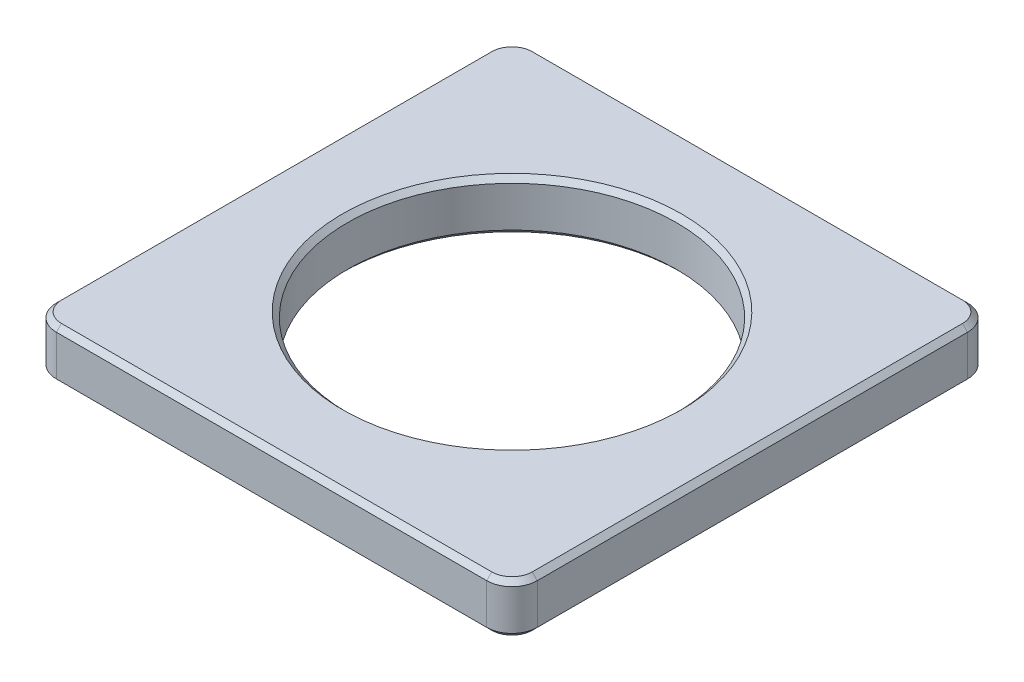
ISO-10303-21;
HEADER;
FILE_DESCRIPTION(('STEP AP214'),'2;1');
FILE_NAME('part.step','',(''),(''),'','','');
FILE_SCHEMA(('AUTOMOTIVE_DESIGN { 1 0 10303 214 1 1 1 1 }'));
ENDSEC;
DATA;
#1=APPLICATION_CONTEXT('core data for automotive mechanical design processes');
#2=APPLICATION_PROTOCOL_DEFINITION('international standard','automotive_design',2000,#1);
#3=PRODUCT_CONTEXT('',#1,'mechanical');
#4=PRODUCT('Part','Part','',(#3));
#5=PRODUCT_RELATED_PRODUCT_CATEGORY('part','',(#4));
#6=PRODUCT_DEFINITION_FORMATION('','',#4);
#7=PRODUCT_DEFINITION_CONTEXT('part definition',#1,'design');
#8=PRODUCT_DEFINITION('design','',#6,#7);
#9=PRODUCT_DEFINITION_SHAPE('','',#8);
#10=(LENGTH_UNIT() NAMED_UNIT(*) SI_UNIT(.MILLI.,.METRE.));
#11=(NAMED_UNIT(*) PLANE_ANGLE_UNIT() SI_UNIT($,.RADIAN.));
#12=(NAMED_UNIT(*) SI_UNIT($,.STERADIAN.) SOLID_ANGLE_UNIT());
#13=UNCERTAINTY_MEASURE_WITH_UNIT(LENGTH_MEASURE(1.E-05),#10,'distance_accuracy_value','');
#14=(GEOMETRIC_REPRESENTATION_CONTEXT(3) GLOBAL_UNCERTAINTY_ASSIGNED_CONTEXT((#13)) GLOBAL_UNIT_ASSIGNED_CONTEXT((#10,
#11,#12)) REPRESENTATION_CONTEXT('',''));
#15=CARTESIAN_POINT('',(0.,0.,0.));
#16=DIRECTION('',(0.,0.,1.));
#17=DIRECTION('',(1.,0.,0.));
#18=AXIS2_PLACEMENT_3D('',#15,#16,#17);
#19=CARTESIAN_POINT('',(0.,10.,0.));
#20=DIRECTION('',(0.,-1.,0.));
#21=DIRECTION('',(0.,0.,-1.));
#22=AXIS2_PLACEMENT_3D('',#19,#20,#21);
#23=PLANE('',#22);
#24=CARTESIAN_POINT('',(0.,10.,0.));
#25=DIRECTION('',(0.,-1.,0.));
#26=DIRECTION('',(0.,0.,-1.));
#27=AXIS2_PLACEMENT_3D('',#24,#25,#26);
#28=CIRCLE('',#27,33.5);
#29=CARTESIAN_POINT('',(0.,10.,-33.5));
#30=VERTEX_POINT('',#29);
#31=EDGE_CURVE('E11',#30,#30,#28,.T.);
#32=ORIENTED_EDGE('',*,*,#31,.T.);
#33=EDGE_LOOP('',(#32));
#34=FACE_BOUND('',#33,.T.);
#35=DIRECTION('',(0.,0.,-1.));
#36=VECTOR('',#35,1.);
#37=CARTESIAN_POINT('',(46.5,10.,0.));
#38=LINE('',#37,#36);
#39=CARTESIAN_POINT('',(46.5,10.,42.5));
#40=VERTEX_POINT('',#39);
#41=CARTESIAN_POINT('',(46.5,10.,-42.5));
#42=VERTEX_POINT('',#41);
#43=EDGE_CURVE('E66',#40,#42,#38,.T.);
#44=ORIENTED_EDGE('',*,*,#43,.T.);
#45=CARTESIAN_POINT('',(42.5,10.,-42.5));
#46=DIRECTION('',(0.,-1.,0.));
#47=DIRECTION('',(0.,0.,-1.));
#48=AXIS2_PLACEMENT_3D('',#45,#46,#47);
#49=CIRCLE('',#48,4.00000000000001);
#50=CARTESIAN_POINT('',(42.5,10.,-46.5));
#51=VERTEX_POINT('',#50);
#52=EDGE_CURVE('E58',#42,#51,#49,.F.);
#53=ORIENTED_EDGE('',*,*,#52,.T.);
#54=DIRECTION('',(-1.,0.,0.));
#55=VECTOR('',#54,1.);
#56=CARTESIAN_POINT('',(0.,10.,-46.5));
#57=LINE('',#56,#55);
#58=CARTESIAN_POINT('',(-42.5,10.,-46.5));
#59=VERTEX_POINT('',#58);
#60=EDGE_CURVE('E259',#51,#59,#57,.T.);
#61=ORIENTED_EDGE('',*,*,#60,.T.);
#62=CARTESIAN_POINT('',(-42.5,10.,-42.5));
#63=DIRECTION('',(0.,-1.,0.));
#64=DIRECTION('',(0.,0.,-1.));
#65=AXIS2_PLACEMENT_3D('',#62,#63,#64);
#66=CIRCLE('',#65,4.00000000000001);
#67=CARTESIAN_POINT('',(-46.5,10.,-42.5));
#68=VERTEX_POINT('',#67);
#69=EDGE_CURVE('E262',#59,#68,#66,.F.);
#70=ORIENTED_EDGE('',*,*,#69,.T.);
#71=DIRECTION('',(0.,0.,1.));
#72=VECTOR('',#71,1.);
#73=CARTESIAN_POINT('',(-46.5,10.,0.));
#74=LINE('',#73,#72);
#75=CARTESIAN_POINT('',(-46.5,10.,42.5));
#76=VERTEX_POINT('',#75);
#77=EDGE_CURVE('E265',#68,#76,#74,.T.);
#78=ORIENTED_EDGE('',*,*,#77,.T.);
#79=CARTESIAN_POINT('',(-42.5,10.,42.5));
#80=DIRECTION('',(0.,-1.,0.));
#81=DIRECTION('',(0.,0.,-1.));
#82=AXIS2_PLACEMENT_3D('',#79,#80,#81);
#83=CIRCLE('',#82,4.00000000000001);
#84=CARTESIAN_POINT('',(-42.5,10.,46.5));
#85=VERTEX_POINT('',#84);
#86=EDGE_CURVE('E268',#76,#85,#83,.F.);
#87=ORIENTED_EDGE('',*,*,#86,.T.);
#88=DIRECTION('',(1.,0.,0.));
#89=VECTOR('',#88,1.);
#90=CARTESIAN_POINT('',(0.,10.,46.5));
#91=LINE('',#90,#89);
#92=CARTESIAN_POINT('',(42.5,10.,46.5));
#93=VERTEX_POINT('',#92);
#94=EDGE_CURVE('E271',#85,#93,#91,.T.);
#95=ORIENTED_EDGE('',*,*,#94,.T.);
#96=CARTESIAN_POINT('',(42.5,10.,42.5));
#97=DIRECTION('',(0.,-1.,0.));
#98=DIRECTION('',(0.,0.,-1.));
#99=AXIS2_PLACEMENT_3D('',#96,#97,#98);
#100=CIRCLE('',#99,4.00000000000001);
#101=EDGE_CURVE('E71',#93,#40,#100,.F.);
#102=ORIENTED_EDGE('',*,*,#101,.T.);
#103=EDGE_LOOP('',(#44,#53,#61,#70,#78,#87,#95,#102));
#104=FACE_BOUND('',#103,.T.);
#105=ADVANCED_FACE('F47',(#34,#104),#23,.F.);
#106=CARTESIAN_POINT('',(0.,0.,0.));
#107=DIRECTION('',(0.,-1.,0.));
#108=DIRECTION('',(0.,0.,-1.));
#109=AXIS2_PLACEMENT_3D('',#106,#107,#108);
#110=PLANE('',#109);
#111=CARTESIAN_POINT('',(0.,0.,0.));
#112=DIRECTION('',(0.,-1.,0.));
#113=DIRECTION('',(0.,0.,-1.));
#114=AXIS2_PLACEMENT_3D('',#111,#112,#113);
#115=CIRCLE('',#114,33.5);
#116=CARTESIAN_POINT('',(0.,0.,-33.5));
#117=VERTEX_POINT('',#116);
#118=EDGE_CURVE('E193',#117,#117,#115,.F.);
#119=ORIENTED_EDGE('',*,*,#118,.T.);
#120=EDGE_LOOP('',(#119));
#121=FACE_BOUND('',#120,.T.);
#122=DIRECTION('',(-1.,0.,0.));
#123=VECTOR('',#122,1.);
#124=CARTESIAN_POINT('',(-42.5,0.,46.5));
#125=LINE('',#124,#123);
#126=CARTESIAN_POINT('',(42.5,0.,46.5));
#127=VERTEX_POINT('',#126);
#128=CARTESIAN_POINT('',(-42.5,0.,46.5));
#129=VERTEX_POINT('',#128);
#130=EDGE_CURVE('E190',#127,#129,#125,.T.);
#131=ORIENTED_EDGE('',*,*,#130,.T.);
#132=CARTESIAN_POINT('',(-42.5,0.,42.5));
#133=DIRECTION('',(0.,-1.,0.));
#134=DIRECTION('',(0.,0.,-1.));
#135=AXIS2_PLACEMENT_3D('',#132,#133,#134);
#136=CIRCLE('',#135,4.);
#137=CARTESIAN_POINT('',(-46.5,0.,42.5));
#138=VERTEX_POINT('',#137);
#139=EDGE_CURVE('E169',#129,#138,#136,.T.);
#140=ORIENTED_EDGE('',*,*,#139,.T.);
#141=DIRECTION('',(0.,0.,-1.));
#142=VECTOR('',#141,1.);
#143=CARTESIAN_POINT('',(-46.5,0.,-42.5));
#144=LINE('',#143,#142);
#145=CARTESIAN_POINT('',(-46.5,0.,-42.5));
#146=VERTEX_POINT('',#145);
#147=EDGE_CURVE('E178',#138,#146,#144,.T.);
#148=ORIENTED_EDGE('',*,*,#147,.T.);
#149=CARTESIAN_POINT('',(-42.5,0.,-42.5));
#150=DIRECTION('',(0.,-1.,0.));
#151=DIRECTION('',(0.,0.,-1.));
#152=AXIS2_PLACEMENT_3D('',#149,#150,#151);
#153=CIRCLE('',#152,4.);
#154=CARTESIAN_POINT('',(-42.5,0.,-46.5));
#155=VERTEX_POINT('',#154);
#156=EDGE_CURVE('E185',#146,#155,#153,.T.);
#157=ORIENTED_EDGE('',*,*,#156,.T.);
#158=DIRECTION('',(1.,0.,0.));
#159=VECTOR('',#158,1.);
#160=CARTESIAN_POINT('',(42.5,0.,-46.5));
#161=LINE('',#160,#159);
#162=CARTESIAN_POINT('',(42.5,0.,-46.5));
#163=VERTEX_POINT('',#162);
#164=EDGE_CURVE('E384',#155,#163,#161,.T.);
#165=ORIENTED_EDGE('',*,*,#164,.T.);
#166=CARTESIAN_POINT('',(42.5,0.,-42.5));
#167=DIRECTION('',(0.,-1.,0.));
#168=DIRECTION('',(0.,0.,-1.));
#169=AXIS2_PLACEMENT_3D('',#166,#167,#168);
#170=CIRCLE('',#169,4.);
#171=CARTESIAN_POINT('',(46.5,0.,-42.5));
#172=VERTEX_POINT('',#171);
#173=EDGE_CURVE('E387',#163,#172,#170,.T.);
#174=ORIENTED_EDGE('',*,*,#173,.T.);
#175=DIRECTION('',(0.,0.,1.));
#176=VECTOR('',#175,1.);
#177=CARTESIAN_POINT('',(46.5,0.,42.5));
#178=LINE('',#177,#176);
#179=CARTESIAN_POINT('',(46.5,0.,42.5));
#180=VERTEX_POINT('',#179);
#181=EDGE_CURVE('E390',#172,#180,#178,.T.);
#182=ORIENTED_EDGE('',*,*,#181,.T.);
#183=CARTESIAN_POINT('',(42.5,0.,42.5));
#184=DIRECTION('',(0.,-1.,0.));
#185=DIRECTION('',(0.,0.,-1.));
#186=AXIS2_PLACEMENT_3D('',#183,#184,#185);
#187=CIRCLE('',#186,4.);
#188=EDGE_CURVE('E200',#180,#127,#187,.T.);
#189=ORIENTED_EDGE('',*,*,#188,.T.);
#190=EDGE_LOOP('',(#131,#140,#148,#157,#165,#174,#182,#189));
#191=FACE_BOUND('',#190,.T.);
#192=ADVANCED_FACE('F188',(#121,#191),#110,.T.);
#193=CARTESIAN_POINT('',(47.5,10.,47.5));
#194=DIRECTION('',(-1.,0.,0.));
#195=DIRECTION('',(0.,0.,1.));
#196=AXIS2_PLACEMENT_3D('',#193,#194,#195);
#197=PLANE('',#196);
#198=DIRECTION('',(0.,-1.,0.));
#199=VECTOR('',#198,1.);
#200=CARTESIAN_POINT('',(47.5,10.,42.5));
#201=LINE('',#200,#199);
#202=CARTESIAN_POINT('',(47.5,9.,42.5));
#203=VERTEX_POINT('',#202);
#204=CARTESIAN_POINT('',(47.5,1.,42.5));
#205=VERTEX_POINT('',#204);
#206=EDGE_CURVE('E369',#203,#205,#201,.T.);
#207=ORIENTED_EDGE('',*,*,#206,.T.);
#208=DIRECTION('',(0.,0.,-1.));
#209=VECTOR('',#208,1.);
#210=CARTESIAN_POINT('',(47.5,1.,-42.5));
#211=LINE('',#210,#209);
#212=CARTESIAN_POINT('',(47.5,1.,-42.5));
#213=VERTEX_POINT('',#212);
#214=EDGE_CURVE('E231',#205,#213,#211,.T.);
#215=ORIENTED_EDGE('',*,*,#214,.T.);
#216=DIRECTION('',(0.,-1.,0.));
#217=VECTOR('',#216,1.);
#218=CARTESIAN_POINT('',(47.5,10.,-42.5));
#219=LINE('',#218,#217);
#220=CARTESIAN_POINT('',(47.5,9.,-42.5));
#221=VERTEX_POINT('',#220);
#222=EDGE_CURVE('E373',#213,#221,#219,.F.);
#223=ORIENTED_EDGE('',*,*,#222,.T.);
#224=DIRECTION('',(0.,0.,1.));
#225=VECTOR('',#224,1.);
#226=CARTESIAN_POINT('',(47.5,9.,47.5));
#227=LINE('',#226,#225);
#228=EDGE_CURVE('E228',#221,#203,#227,.T.);
#229=ORIENTED_EDGE('',*,*,#228,.T.);
#230=EDGE_LOOP('',(#207,#215,#223,#229));
#231=FACE_BOUND('',#230,.T.);
#232=ADVANCED_FACE('F448',(#231),#197,.F.);
#233=CARTESIAN_POINT('',(-47.5,10.,-47.5));
#234=DIRECTION('',(0.,0.,1.));
#235=DIRECTION('',(1.,0.,0.));
#236=AXIS2_PLACEMENT_3D('',#233,#234,#235);
#237=PLANE('',#236);
#238=DIRECTION('',(0.,-1.,0.));
#239=VECTOR('',#238,1.);
#240=CARTESIAN_POINT('',(42.5,10.,-47.5));
#241=LINE('',#240,#239);
#242=CARTESIAN_POINT('',(42.5,9.,-47.5));
#243=VERTEX_POINT('',#242);
#244=CARTESIAN_POINT('',(42.5,1.,-47.5));
#245=VERTEX_POINT('',#244);
#246=EDGE_CURVE('E359',#243,#245,#241,.T.);
#247=ORIENTED_EDGE('',*,*,#246,.T.);
#248=DIRECTION('',(-1.,0.,0.));
#249=VECTOR('',#248,1.);
#250=CARTESIAN_POINT('',(-42.5,1.,-47.5));
#251=LINE('',#250,#249);
#252=CARTESIAN_POINT('',(-42.5,1.,-47.5));
#253=VERTEX_POINT('',#252);
#254=EDGE_CURVE('E244',#245,#253,#251,.T.);
#255=ORIENTED_EDGE('',*,*,#254,.T.);
#256=DIRECTION('',(0.,-1.,0.));
#257=VECTOR('',#256,1.);
#258=CARTESIAN_POINT('',(-42.5,10.,-47.5));
#259=LINE('',#258,#257);
#260=CARTESIAN_POINT('',(-42.5,9.,-47.5));
#261=VERTEX_POINT('',#260);
#262=EDGE_CURVE('E365',#253,#261,#259,.F.);
#263=ORIENTED_EDGE('',*,*,#262,.T.);
#264=DIRECTION('',(1.,0.,0.));
#265=VECTOR('',#264,1.);
#266=CARTESIAN_POINT('',(-47.5,9.,-47.5));
#267=LINE('',#266,#265);
#268=EDGE_CURVE('E241',#261,#243,#267,.T.);
#269=ORIENTED_EDGE('',*,*,#268,.T.);
#270=EDGE_LOOP('',(#247,#255,#263,#269));
#271=FACE_BOUND('',#270,.T.);
#272=ADVANCED_FACE('F432',(#271),#237,.F.);
#273=CARTESIAN_POINT('',(-47.5,10.,47.5));
#274=DIRECTION('',(1.,0.,0.));
#275=DIRECTION('',(0.,0.,-1.));
#276=AXIS2_PLACEMENT_3D('',#273,#274,#275);
#277=PLANE('',#276);
#278=DIRECTION('',(0.,-1.,0.));
#279=VECTOR('',#278,1.);
#280=CARTESIAN_POINT('',(-47.5,10.,-42.5));
#281=LINE('',#280,#279);
#282=CARTESIAN_POINT('',(-47.5,9.,-42.5));
#283=VERTEX_POINT('',#282);
#284=CARTESIAN_POINT('',(-47.5,1.,-42.5));
#285=VERTEX_POINT('',#284);
#286=EDGE_CURVE('E356',#283,#285,#281,.T.);
#287=ORIENTED_EDGE('',*,*,#286,.T.);
#288=DIRECTION('',(0.,0.,1.));
#289=VECTOR('',#288,1.);
#290=CARTESIAN_POINT('',(-47.5,1.,42.5));
#291=LINE('',#290,#289);
#292=CARTESIAN_POINT('',(-47.5,1.,42.5));
#293=VERTEX_POINT('',#292);
#294=EDGE_CURVE('E256',#285,#293,#291,.T.);
#295=ORIENTED_EDGE('',*,*,#294,.T.);
#296=DIRECTION('',(0.,-1.,0.));
#297=VECTOR('',#296,1.);
#298=CARTESIAN_POINT('',(-47.5,10.,42.5));
#299=LINE('',#298,#297);
#300=CARTESIAN_POINT('',(-47.5,9.,42.5));
#301=VERTEX_POINT('',#300);
#302=EDGE_CURVE('E304',#293,#301,#299,.F.);
#303=ORIENTED_EDGE('',*,*,#302,.T.);
#304=DIRECTION('',(0.,0.,-1.));
#305=VECTOR('',#304,1.);
#306=CARTESIAN_POINT('',(-47.5,9.,47.5));
#307=LINE('',#306,#305);
#308=EDGE_CURVE('E253',#301,#283,#307,.T.);
#309=ORIENTED_EDGE('',*,*,#308,.T.);
#310=EDGE_LOOP('',(#287,#295,#303,#309));
#311=FACE_BOUND('',#310,.T.);
#312=ADVANCED_FACE('F353',(#311),#277,.F.);
#313=CARTESIAN_POINT('',(-47.5,10.,47.5));
#314=DIRECTION('',(0.,0.,-1.));
#315=DIRECTION('',(-1.,0.,0.));
#316=AXIS2_PLACEMENT_3D('',#313,#314,#315);
#317=PLANE('',#316);
#318=DIRECTION('',(0.,-1.,0.));
#319=VECTOR('',#318,1.);
#320=CARTESIAN_POINT('',(-42.5,10.,47.5));
#321=LINE('',#320,#319);
#322=CARTESIAN_POINT('',(-42.5,9.,47.5));
#323=VERTEX_POINT('',#322);
#324=CARTESIAN_POINT('',(-42.5,1.,47.5));
#325=VERTEX_POINT('',#324);
#326=EDGE_CURVE('E350',#323,#325,#321,.T.);
#327=ORIENTED_EDGE('',*,*,#326,.T.);
#328=DIRECTION('',(1.,0.,0.));
#329=VECTOR('',#328,1.);
#330=CARTESIAN_POINT('',(42.5,1.,47.5));
#331=LINE('',#330,#329);
#332=CARTESIAN_POINT('',(42.5,1.,47.5));
#333=VERTEX_POINT('',#332);
#334=EDGE_CURVE('E219',#325,#333,#331,.T.);
#335=ORIENTED_EDGE('',*,*,#334,.T.);
#336=DIRECTION('',(0.,-1.,0.));
#337=VECTOR('',#336,1.);
#338=CARTESIAN_POINT('',(42.5,10.,47.5));
#339=LINE('',#338,#337);
#340=CARTESIAN_POINT('',(42.5,9.,47.5));
#341=VERTEX_POINT('',#340);
#342=EDGE_CURVE('E186',#333,#341,#339,.F.);
#343=ORIENTED_EDGE('',*,*,#342,.T.);
#344=DIRECTION('',(-1.,0.,0.));
#345=VECTOR('',#344,1.);
#346=CARTESIAN_POINT('',(-47.5,9.,47.5));
#347=LINE('',#346,#345);
#348=EDGE_CURVE('E216',#341,#323,#347,.T.);
#349=ORIENTED_EDGE('',*,*,#348,.T.);
#350=EDGE_LOOP('',(#327,#335,#343,#349));
#351=FACE_BOUND('',#350,.T.);
#352=ADVANCED_FACE('F405',(#351),#317,.F.);
#353=CARTESIAN_POINT('',(0.,10.,0.));
#354=DIRECTION('',(0.,-1.,0.));
#355=DIRECTION('',(0.,0.,-1.));
#356=AXIS2_PLACEMENT_3D('',#353,#354,#355);
#357=CYLINDRICAL_SURFACE('',#356,32.5);
#358=CARTESIAN_POINT('',(0.,0.999999999999994,0.));
#359=DIRECTION('',(0.,-1.,0.));
#360=DIRECTION('',(0.,0.,-1.));
#361=AXIS2_PLACEMENT_3D('',#358,#359,#360);
#362=CIRCLE('',#361,32.5);
#363=CARTESIAN_POINT('',(0.,0.999999999999994,-32.5));
#364=VERTEX_POINT('',#363);
#365=EDGE_CURVE('E207',#364,#364,#362,.T.);
#366=ORIENTED_EDGE('',*,*,#365,.T.);
#367=EDGE_LOOP('',(#366));
#368=FACE_BOUND('',#367,.T.);
#369=CARTESIAN_POINT('',(0.,8.99999999999999,0.));
#370=DIRECTION('',(0.,-1.,0.));
#371=DIRECTION('',(0.,0.,-1.));
#372=AXIS2_PLACEMENT_3D('',#369,#370,#371);
#373=CIRCLE('',#372,32.5);
#374=CARTESIAN_POINT('',(0.,8.99999999999999,-32.5));
#375=VERTEX_POINT('',#374);
#376=EDGE_CURVE('E198',#375,#375,#373,.F.);
#377=ORIENTED_EDGE('',*,*,#376,.T.);
#378=EDGE_LOOP('',(#377));
#379=FACE_BOUND('',#378,.T.);
#380=ADVANCED_FACE('F465',(#368,#379),#357,.F.);
#381=CARTESIAN_POINT('',(-42.5,10.,-42.5));
#382=DIRECTION('',(0.,-1.,0.));
#383=DIRECTION('',(0.,0.,-1.));
#384=AXIS2_PLACEMENT_3D('',#381,#382,#383);
#385=CYLINDRICAL_SURFACE('',#384,5.);
#386=ORIENTED_EDGE('',*,*,#262,.F.);
#387=CARTESIAN_POINT('',(-42.5,1.,-42.5));
#388=DIRECTION('',(0.,-1.,0.));
#389=DIRECTION('',(0.,0.,-1.));
#390=AXIS2_PLACEMENT_3D('',#387,#388,#389);
#391=CIRCLE('',#390,5.);
#392=EDGE_CURVE('E250',#253,#285,#391,.F.);
#393=ORIENTED_EDGE('',*,*,#392,.T.);
#394=ORIENTED_EDGE('',*,*,#286,.F.);
#395=CARTESIAN_POINT('',(-42.5,9.,-42.5));
#396=DIRECTION('',(0.,-1.,0.));
#397=DIRECTION('',(0.,0.,-1.));
#398=AXIS2_PLACEMENT_3D('',#395,#396,#397);
#399=CIRCLE('',#398,5.);
#400=EDGE_CURVE('E247',#283,#261,#399,.T.);
#401=ORIENTED_EDGE('',*,*,#400,.T.);
#402=EDGE_LOOP('',(#386,#393,#394,#401));
#403=FACE_BOUND('',#402,.T.);
#404=ADVANCED_FACE('F486',(#403),#385,.T.);
#405=CARTESIAN_POINT('',(42.5,10.,-42.5));
#406=DIRECTION('',(0.,-1.,0.));
#407=DIRECTION('',(0.,0.,-1.));
#408=AXIS2_PLACEMENT_3D('',#405,#406,#407);
#409=CYLINDRICAL_SURFACE('',#408,5.);
#410=ORIENTED_EDGE('',*,*,#222,.F.);
#411=CARTESIAN_POINT('',(42.5,1.,-42.5));
#412=DIRECTION('',(0.,-1.,0.));
#413=DIRECTION('',(0.,0.,-1.));
#414=AXIS2_PLACEMENT_3D('',#411,#412,#413);
#415=CIRCLE('',#414,5.);
#416=EDGE_CURVE('E238',#213,#245,#415,.F.);
#417=ORIENTED_EDGE('',*,*,#416,.T.);
#418=ORIENTED_EDGE('',*,*,#246,.F.);
#419=CARTESIAN_POINT('',(42.5,9.,-42.5));
#420=DIRECTION('',(0.,-1.,0.));
#421=DIRECTION('',(0.,0.,-1.));
#422=AXIS2_PLACEMENT_3D('',#419,#420,#421);
#423=CIRCLE('',#422,5.);
#424=EDGE_CURVE('E234',#243,#221,#423,.T.);
#425=ORIENTED_EDGE('',*,*,#424,.T.);
#426=EDGE_LOOP('',(#410,#417,#418,#425));
#427=FACE_BOUND('',#426,.T.);
#428=ADVANCED_FACE('F437',(#427),#409,.T.);
#429=CARTESIAN_POINT('',(42.5,10.,42.5));
#430=DIRECTION('',(0.,-1.,0.));
#431=DIRECTION('',(0.,0.,-1.));
#432=AXIS2_PLACEMENT_3D('',#429,#430,#431);
#433=CYLINDRICAL_SURFACE('',#432,5.);
#434=ORIENTED_EDGE('',*,*,#342,.F.);
#435=CARTESIAN_POINT('',(42.5,1.,42.5));
#436=DIRECTION('',(0.,-1.,0.));
#437=DIRECTION('',(0.,0.,-1.));
#438=AXIS2_PLACEMENT_3D('',#435,#436,#437);
#439=CIRCLE('',#438,5.);
#440=EDGE_CURVE('E225',#333,#205,#439,.F.);
#441=ORIENTED_EDGE('',*,*,#440,.T.);
#442=ORIENTED_EDGE('',*,*,#206,.F.);
#443=CARTESIAN_POINT('',(42.5,9.,42.5));
#444=DIRECTION('',(0.,-1.,0.));
#445=DIRECTION('',(0.,0.,-1.));
#446=AXIS2_PLACEMENT_3D('',#443,#444,#445);
#447=CIRCLE('',#446,5.);
#448=EDGE_CURVE('E222',#203,#341,#447,.T.);
#449=ORIENTED_EDGE('',*,*,#448,.T.);
#450=EDGE_LOOP('',(#434,#441,#442,#449));
#451=FACE_BOUND('',#450,.T.);
#452=ADVANCED_FACE('F407',(#451),#433,.T.);
#453=CARTESIAN_POINT('',(-42.5,10.,42.5));
#454=DIRECTION('',(0.,-1.,0.));
#455=DIRECTION('',(0.,0.,-1.));
#456=AXIS2_PLACEMENT_3D('',#453,#454,#455);
#457=CYLINDRICAL_SURFACE('',#456,5.);
#458=ORIENTED_EDGE('',*,*,#302,.F.);
#459=CARTESIAN_POINT('',(-42.5,1.,42.5));
#460=DIRECTION('',(0.,-1.,0.));
#461=DIRECTION('',(0.,0.,-1.));
#462=AXIS2_PLACEMENT_3D('',#459,#460,#461);
#463=CIRCLE('',#462,5.);
#464=EDGE_CURVE('E171',#293,#325,#463,.F.);
#465=ORIENTED_EDGE('',*,*,#464,.T.);
#466=ORIENTED_EDGE('',*,*,#326,.F.);
#467=CARTESIAN_POINT('',(-42.5,9.,42.5));
#468=DIRECTION('',(0.,-1.,0.));
#469=DIRECTION('',(0.,0.,-1.));
#470=AXIS2_PLACEMENT_3D('',#467,#468,#469);
#471=CIRCLE('',#470,5.);
#472=EDGE_CURVE('E211',#323,#301,#471,.T.);
#473=ORIENTED_EDGE('',*,*,#472,.T.);
#474=EDGE_LOOP('',(#458,#465,#466,#473));
#475=FACE_BOUND('',#474,.T.);
#476=ADVANCED_FACE('F348',(#475),#457,.T.);
#477=CARTESIAN_POINT('',(0.,0.,0.));
#478=DIRECTION('',(0.,-1.,0.));
#479=DIRECTION('',(0.,0.,-1.));
#480=AXIS2_PLACEMENT_3D('',#477,#478,#479);
#481=CONICAL_SURFACE('',#480,33.5,0.785398163397445);
#482=ORIENTED_EDGE('',*,*,#365,.F.);
#483=EDGE_LOOP('',(#482));
#484=FACE_BOUND('',#483,.T.);
#485=ORIENTED_EDGE('',*,*,#118,.F.);
#486=EDGE_LOOP('',(#485));
#487=FACE_BOUND('',#486,.T.);
#488=ADVANCED_FACE('F515',(#484,#487),#481,.F.);
#489=CARTESIAN_POINT('',(42.5,0.,-42.5));
#490=DIRECTION('',(0.,1.,0.));
#491=DIRECTION('',(0.,0.,1.));
#492=AXIS2_PLACEMENT_3D('',#489,#490,#491);
#493=CONICAL_SURFACE('',#492,4.,0.78539816339745);
#494=DIRECTION('',(0.,-0.707106781186547,0.707106781186547));
#495=VECTOR('',#494,1.);
#496=CARTESIAN_POINT('',(42.5,1.,-47.5));
#497=LINE('',#496,#495);
#498=EDGE_CURVE('E296',#245,#163,#497,.T.);
#499=ORIENTED_EDGE('',*,*,#498,.F.);
#500=ORIENTED_EDGE('',*,*,#416,.F.);
#501=DIRECTION('',(0.707106781186547,0.707106781186547,0.));
#502=VECTOR('',#501,1.);
#503=CARTESIAN_POINT('',(46.5,0.,-42.5));
#504=LINE('',#503,#502);
#505=EDGE_CURVE('E300',#172,#213,#504,.T.);
#506=ORIENTED_EDGE('',*,*,#505,.F.);
#507=ORIENTED_EDGE('',*,*,#173,.F.);
#508=EDGE_LOOP('',(#499,#500,#506,#507));
#509=FACE_BOUND('',#508,.T.);
#510=ADVANCED_FACE('F441',(#509),#493,.T.);
#511=CARTESIAN_POINT('',(47.5,1.,47.5));
#512=DIRECTION('',(0.707106781186547,-0.707106781186547,0.));
#513=DIRECTION('',(0.,0.,1.));
#514=AXIS2_PLACEMENT_3D('',#511,#512,#513);
#515=PLANE('',#514);
#516=ORIENTED_EDGE('',*,*,#505,.T.);
#517=ORIENTED_EDGE('',*,*,#214,.F.);
#518=DIRECTION('',(0.707106781186547,0.707106781186547,0.));
#519=VECTOR('',#518,1.);
#520=CARTESIAN_POINT('',(46.5,0.,42.5));
#521=LINE('',#520,#519);
#522=EDGE_CURVE('E292',#180,#205,#521,.T.);
#523=ORIENTED_EDGE('',*,*,#522,.F.);
#524=ORIENTED_EDGE('',*,*,#181,.F.);
#525=EDGE_LOOP('',(#516,#517,#523,#524));
#526=FACE_BOUND('',#525,.T.);
#527=ADVANCED_FACE('F446',(#526),#515,.T.);
#528=CARTESIAN_POINT('',(-47.5,1.,-47.5));
#529=DIRECTION('',(0.,-0.707106781186547,-0.707106781186547));
#530=DIRECTION('',(1.,0.,0.));
#531=AXIS2_PLACEMENT_3D('',#528,#529,#530);
#532=PLANE('',#531);
#533=ORIENTED_EDGE('',*,*,#498,.T.);
#534=ORIENTED_EDGE('',*,*,#164,.F.);
#535=DIRECTION('',(0.,-0.707106781186547,0.707106781186547));
#536=VECTOR('',#535,1.);
#537=CARTESIAN_POINT('',(-42.5,1.,-47.5));
#538=LINE('',#537,#536);
#539=EDGE_CURVE('E288',#253,#155,#538,.T.);
#540=ORIENTED_EDGE('',*,*,#539,.F.);
#541=ORIENTED_EDGE('',*,*,#254,.F.);
#542=EDGE_LOOP('',(#533,#534,#540,#541));
#543=FACE_BOUND('',#542,.T.);
#544=ADVANCED_FACE('F538',(#543),#532,.T.);
#545=CARTESIAN_POINT('',(42.5,0.,42.5));
#546=DIRECTION('',(0.,1.,0.));
#547=DIRECTION('',(0.,0.,1.));
#548=AXIS2_PLACEMENT_3D('',#545,#546,#547);
#549=CONICAL_SURFACE('',#548,4.,0.78539816339745);
#550=ORIENTED_EDGE('',*,*,#522,.T.);
#551=ORIENTED_EDGE('',*,*,#440,.F.);
#552=DIRECTION('',(0.,0.707106781186547,0.707106781186547));
#553=VECTOR('',#552,1.);
#554=CARTESIAN_POINT('',(42.5,0.,46.5));
#555=LINE('',#554,#553);
#556=EDGE_CURVE('E284',#127,#333,#555,.T.);
#557=ORIENTED_EDGE('',*,*,#556,.F.);
#558=ORIENTED_EDGE('',*,*,#188,.F.);
#559=EDGE_LOOP('',(#550,#551,#557,#558));
#560=FACE_BOUND('',#559,.T.);
#561=ADVANCED_FACE('F399',(#560),#549,.T.);
#562=CARTESIAN_POINT('',(-42.5,0.,-42.5));
#563=DIRECTION('',(0.,1.,0.));
#564=DIRECTION('',(0.,0.,1.));
#565=AXIS2_PLACEMENT_3D('',#562,#563,#564);
#566=CONICAL_SURFACE('',#565,4.,0.78539816339745);
#567=ORIENTED_EDGE('',*,*,#539,.T.);
#568=ORIENTED_EDGE('',*,*,#156,.F.);
#569=DIRECTION('',(0.707106781186547,-0.707106781186547,0.));
#570=VECTOR('',#569,1.);
#571=CARTESIAN_POINT('',(-47.5,1.,-42.5));
#572=LINE('',#571,#570);
#573=EDGE_CURVE('E181',#285,#146,#572,.T.);
#574=ORIENTED_EDGE('',*,*,#573,.F.);
#575=ORIENTED_EDGE('',*,*,#392,.F.);
#576=EDGE_LOOP('',(#567,#568,#574,#575));
#577=FACE_BOUND('',#576,.T.);
#578=ADVANCED_FACE('F554',(#577),#566,.T.);
#579=CARTESIAN_POINT('',(-47.5,1.,47.5));
#580=DIRECTION('',(0.,-0.707106781186547,0.707106781186547));
#581=DIRECTION('',(-1.,0.,0.));
#582=AXIS2_PLACEMENT_3D('',#579,#580,#581);
#583=PLANE('',#582);
#584=ORIENTED_EDGE('',*,*,#556,.T.);
#585=ORIENTED_EDGE('',*,*,#334,.F.);
#586=DIRECTION('',(0.,0.707106781186547,0.707106781186547));
#587=VECTOR('',#586,1.);
#588=CARTESIAN_POINT('',(-42.5,0.,46.5));
#589=LINE('',#588,#587);
#590=EDGE_CURVE('E175',#129,#325,#589,.T.);
#591=ORIENTED_EDGE('',*,*,#590,.F.);
#592=ORIENTED_EDGE('',*,*,#130,.F.);
#593=EDGE_LOOP('',(#584,#585,#591,#592));
#594=FACE_BOUND('',#593,.T.);
#595=ADVANCED_FACE('F402',(#594),#583,.T.);
#596=CARTESIAN_POINT('',(-47.5,1.,47.5));
#597=DIRECTION('',(-0.707106781186547,-0.707106781186547,0.));
#598=DIRECTION('',(0.,0.,-1.));
#599=AXIS2_PLACEMENT_3D('',#596,#597,#598);
#600=PLANE('',#599);
#601=ORIENTED_EDGE('',*,*,#573,.T.);
#602=ORIENTED_EDGE('',*,*,#147,.F.);
#603=DIRECTION('',(0.707106781186547,-0.707106781186547,0.));
#604=VECTOR('',#603,1.);
#605=CARTESIAN_POINT('',(-47.5,1.,42.5));
#606=LINE('',#605,#604);
#607=EDGE_CURVE('E165',#293,#138,#606,.T.);
#608=ORIENTED_EDGE('',*,*,#607,.F.);
#609=ORIENTED_EDGE('',*,*,#294,.F.);
#610=EDGE_LOOP('',(#601,#602,#608,#609));
#611=FACE_BOUND('',#610,.T.);
#612=ADVANCED_FACE('F179',(#611),#600,.T.);
#613=CARTESIAN_POINT('',(-42.5,0.,42.5));
#614=DIRECTION('',(0.,1.,0.));
#615=DIRECTION('',(0.,0.,1.));
#616=AXIS2_PLACEMENT_3D('',#613,#614,#615);
#617=CONICAL_SURFACE('',#616,4.,0.78539816339745);
#618=ORIENTED_EDGE('',*,*,#590,.T.);
#619=ORIENTED_EDGE('',*,*,#464,.F.);
#620=ORIENTED_EDGE('',*,*,#607,.T.);
#621=ORIENTED_EDGE('',*,*,#139,.F.);
#622=EDGE_LOOP('',(#618,#619,#620,#621));
#623=FACE_BOUND('',#622,.T.);
#624=ADVANCED_FACE('F167',(#623),#617,.T.);
#625=CARTESIAN_POINT('',(0.,8.99999999999999,0.));
#626=DIRECTION('',(0.,1.,0.));
#627=DIRECTION('',(0.,0.,1.));
#628=AXIS2_PLACEMENT_3D('',#625,#626,#627);
#629=CONICAL_SURFACE('',#628,32.5,0.785398163397448);
#630=ORIENTED_EDGE('',*,*,#31,.F.);
#631=EDGE_LOOP('',(#630));
#632=FACE_BOUND('',#631,.T.);
#633=ORIENTED_EDGE('',*,*,#376,.F.);
#634=EDGE_LOOP('',(#633));
#635=FACE_BOUND('',#634,.T.);
#636=ADVANCED_FACE('F584',(#632,#635),#629,.F.);
#637=CARTESIAN_POINT('',(-42.5,10.,42.5));
#638=DIRECTION('',(0.,-1.,0.));
#639=DIRECTION('',(0.,0.,-1.));
#640=AXIS2_PLACEMENT_3D('',#637,#638,#639);
#641=CONICAL_SURFACE('',#640,4.00000000000001,0.785398163397443);
#642=DIRECTION('',(0.707106781186543,0.707106781186552,0.));
#643=VECTOR('',#642,1.);
#644=CARTESIAN_POINT('',(-47.5,9.,42.5));
#645=LINE('',#644,#643);
#646=EDGE_CURVE('E326',#301,#76,#645,.T.);
#647=ORIENTED_EDGE('',*,*,#646,.F.);
#648=ORIENTED_EDGE('',*,*,#472,.F.);
#649=DIRECTION('',(0.,-0.707106781186552,0.707106781186543));
#650=VECTOR('',#649,1.);
#651=CARTESIAN_POINT('',(-42.5,10.,46.5));
#652=LINE('',#651,#650);
#653=EDGE_CURVE('E52',#85,#323,#652,.T.);
#654=ORIENTED_EDGE('',*,*,#653,.F.);
#655=ORIENTED_EDGE('',*,*,#86,.F.);
#656=EDGE_LOOP('',(#647,#648,#654,#655));
#657=FACE_BOUND('',#656,.T.);
#658=ADVANCED_FACE('F50',(#657),#641,.T.);
#659=CARTESIAN_POINT('',(0.,10.,46.5));
#660=DIRECTION('',(0.,-0.707106781186543,-0.707106781186552));
#661=DIRECTION('',(1.,0.,0.));
#662=AXIS2_PLACEMENT_3D('',#659,#660,#661);
#663=PLANE('',#662);
#664=ORIENTED_EDGE('',*,*,#653,.T.);
#665=ORIENTED_EDGE('',*,*,#348,.F.);
#666=DIRECTION('',(0.,-0.707106781186552,0.707106781186543));
#667=VECTOR('',#666,1.);
#668=CARTESIAN_POINT('',(42.5,10.,46.5));
#669=LINE('',#668,#667);
#670=EDGE_CURVE('E323',#93,#341,#669,.T.);
#671=ORIENTED_EDGE('',*,*,#670,.F.);
#672=ORIENTED_EDGE('',*,*,#94,.F.);
#673=EDGE_LOOP('',(#664,#665,#671,#672));
#674=FACE_BOUND('',#673,.T.);
#675=ADVANCED_FACE('F339',(#674),#663,.F.);
#676=CARTESIAN_POINT('',(-46.5,10.,0.));
#677=DIRECTION('',(0.707106781186552,-0.707106781186543,0.));
#678=DIRECTION('',(0.,0.,1.));
#679=AXIS2_PLACEMENT_3D('',#676,#677,#678);
#680=PLANE('',#679);
#681=ORIENTED_EDGE('',*,*,#646,.T.);
#682=ORIENTED_EDGE('',*,*,#77,.F.);
#683=DIRECTION('',(0.707106781186543,0.707106781186552,0.));
#684=VECTOR('',#683,1.);
#685=CARTESIAN_POINT('',(-47.5,9.,-42.5));
#686=LINE('',#685,#684);
#687=EDGE_CURVE('E319',#283,#68,#686,.T.);
#688=ORIENTED_EDGE('',*,*,#687,.F.);
#689=ORIENTED_EDGE('',*,*,#308,.F.);
#690=EDGE_LOOP('',(#681,#682,#688,#689));
#691=FACE_BOUND('',#690,.T.);
#692=ADVANCED_FACE('F606',(#691),#680,.F.);
#693=CARTESIAN_POINT('',(42.5,10.,42.5));
#694=DIRECTION('',(0.,-1.,0.));
#695=DIRECTION('',(0.,0.,-1.));
#696=AXIS2_PLACEMENT_3D('',#693,#694,#695);
#697=CONICAL_SURFACE('',#696,4.00000000000001,0.785398163397443);
#698=ORIENTED_EDGE('',*,*,#670,.T.);
#699=ORIENTED_EDGE('',*,*,#448,.F.);
#700=DIRECTION('',(0.707106781186543,-0.707106781186552,0.));
#701=VECTOR('',#700,1.);
#702=CARTESIAN_POINT('',(46.5,10.,42.5));
#703=LINE('',#702,#701);
#704=EDGE_CURVE('E315',#40,#203,#703,.T.);
#705=ORIENTED_EDGE('',*,*,#704,.F.);
#706=ORIENTED_EDGE('',*,*,#101,.F.);
#707=EDGE_LOOP('',(#698,#699,#705,#706));
#708=FACE_BOUND('',#707,.T.);
#709=ADVANCED_FACE('F411',(#708),#697,.T.);
#710=CARTESIAN_POINT('',(-42.5,10.,-42.5));
#711=DIRECTION('',(0.,-1.,0.));
#712=DIRECTION('',(0.,0.,-1.));
#713=AXIS2_PLACEMENT_3D('',#710,#711,#712);
#714=CONICAL_SURFACE('',#713,4.00000000000001,0.785398163397443);
#715=ORIENTED_EDGE('',*,*,#687,.T.);
#716=ORIENTED_EDGE('',*,*,#69,.F.);
#717=DIRECTION('',(0.,0.707106781186552,0.707106781186543));
#718=VECTOR('',#717,1.);
#719=CARTESIAN_POINT('',(-42.5,9.,-47.5));
#720=LINE('',#719,#718);
#721=EDGE_CURVE('E311',#261,#59,#720,.T.);
#722=ORIENTED_EDGE('',*,*,#721,.F.);
#723=ORIENTED_EDGE('',*,*,#400,.F.);
#724=EDGE_LOOP('',(#715,#716,#722,#723));
#725=FACE_BOUND('',#724,.T.);
#726=ADVANCED_FACE('F425',(#725),#714,.T.);
#727=CARTESIAN_POINT('',(46.5,10.,0.));
#728=DIRECTION('',(-0.707106781186552,-0.707106781186543,0.));
#729=DIRECTION('',(0.,0.,-1.));
#730=AXIS2_PLACEMENT_3D('',#727,#728,#729);
#731=PLANE('',#730);
#732=ORIENTED_EDGE('',*,*,#704,.T.);
#733=ORIENTED_EDGE('',*,*,#228,.F.);
#734=DIRECTION('',(0.707106781186543,-0.707106781186552,0.));
#735=VECTOR('',#734,1.);
#736=CARTESIAN_POINT('',(46.5,10.,-42.5));
#737=LINE('',#736,#735);
#738=EDGE_CURVE('E308',#42,#221,#737,.T.);
#739=ORIENTED_EDGE('',*,*,#738,.F.);
#740=ORIENTED_EDGE('',*,*,#43,.F.);
#741=EDGE_LOOP('',(#732,#733,#739,#740));
#742=FACE_BOUND('',#741,.T.);
#743=ADVANCED_FACE('F414',(#742),#731,.F.);
#744=CARTESIAN_POINT('',(0.,10.,-46.5));
#745=DIRECTION('',(0.,-0.707106781186543,0.707106781186552));
#746=DIRECTION('',(-1.,0.,0.));
#747=AXIS2_PLACEMENT_3D('',#744,#745,#746);
#748=PLANE('',#747);
#749=ORIENTED_EDGE('',*,*,#721,.T.);
#750=ORIENTED_EDGE('',*,*,#60,.F.);
#751=DIRECTION('',(0.,0.707106781186552,0.707106781186543));
#752=VECTOR('',#751,1.);
#753=CARTESIAN_POINT('',(42.5,9.,-47.5));
#754=LINE('',#753,#752);
#755=EDGE_CURVE('E305',#243,#51,#754,.T.);
#756=ORIENTED_EDGE('',*,*,#755,.F.);
#757=ORIENTED_EDGE('',*,*,#268,.F.);
#758=EDGE_LOOP('',(#749,#750,#756,#757));
#759=FACE_BOUND('',#758,.T.);
#760=ADVANCED_FACE('F429',(#759),#748,.F.);
#761=CARTESIAN_POINT('',(42.5,10.,-42.5));
#762=DIRECTION('',(0.,-1.,0.));
#763=DIRECTION('',(0.,0.,-1.));
#764=AXIS2_PLACEMENT_3D('',#761,#762,#763);
#765=CONICAL_SURFACE('',#764,4.00000000000001,0.785398163397443);
#766=ORIENTED_EDGE('',*,*,#738,.T.);
#767=ORIENTED_EDGE('',*,*,#424,.F.);
#768=ORIENTED_EDGE('',*,*,#755,.T.);
#769=ORIENTED_EDGE('',*,*,#52,.F.);
#770=EDGE_LOOP('',(#766,#767,#768,#769));
#771=FACE_BOUND('',#770,.T.);
#772=ADVANCED_FACE('F418',(#771),#765,.T.);
#773=CLOSED_SHELL('',(#105,#192,#232,#272,#312,#352,#380,#404,#428,#452,#476,#488,#510,#527,
#544,#561,#578,#595,#612,#624,#636,#658,#675,#692,#709,#726,#743,#760,#772));
#774=MANIFOLD_SOLID_BREP('B2',#773);
#775=ADVANCED_BREP_SHAPE_REPRESENTATION('',(#18,#774),#14);
#776=SHAPE_DEFINITION_REPRESENTATION(#9,#775);
ENDSEC;
END-ISO-10303-21;
